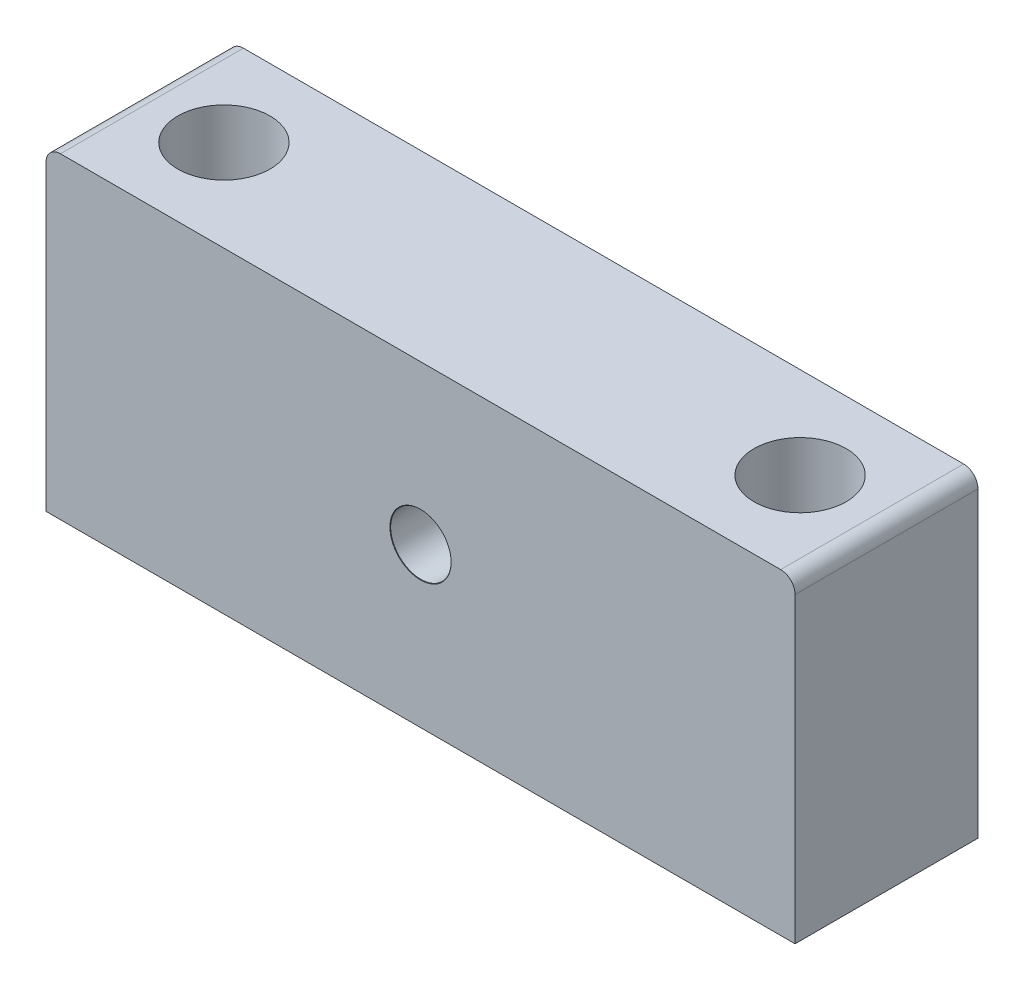
ISO-10303-21;
HEADER;
FILE_DESCRIPTION(('STEP AP214'),'2;1');
FILE_NAME('part.step','',(''),(''),'','','');
FILE_SCHEMA(('AUTOMOTIVE_DESIGN { 1 0 10303 214 1 1 1 1 }'));
ENDSEC;
DATA;
#1=APPLICATION_CONTEXT('core data for automotive mechanical design processes');
#2=APPLICATION_PROTOCOL_DEFINITION('international standard','automotive_design',2000,#1);
#3=PRODUCT_CONTEXT('',#1,'mechanical');
#4=PRODUCT('Part','Part','',(#3));
#5=PRODUCT_RELATED_PRODUCT_CATEGORY('part','',(#4));
#6=PRODUCT_DEFINITION_FORMATION('','',#4);
#7=PRODUCT_DEFINITION_CONTEXT('part definition',#1,'design');
#8=PRODUCT_DEFINITION('design','',#6,#7);
#9=PRODUCT_DEFINITION_SHAPE('','',#8);
#10=(LENGTH_UNIT() NAMED_UNIT(*) SI_UNIT(.MILLI.,.METRE.));
#11=(NAMED_UNIT(*) PLANE_ANGLE_UNIT() SI_UNIT($,.RADIAN.));
#12=(NAMED_UNIT(*) SI_UNIT($,.STERADIAN.) SOLID_ANGLE_UNIT());
#13=UNCERTAINTY_MEASURE_WITH_UNIT(LENGTH_MEASURE(1.E-05),#10,'distance_accuracy_value','');
#14=(GEOMETRIC_REPRESENTATION_CONTEXT(3) GLOBAL_UNCERTAINTY_ASSIGNED_CONTEXT((#13)) GLOBAL_UNIT_ASSIGNED_CONTEXT((#10,
#11,#12)) REPRESENTATION_CONTEXT('',''));
#15=CARTESIAN_POINT('',(0.,0.,0.));
#16=DIRECTION('',(0.,0.,1.));
#17=DIRECTION('',(1.,0.,0.));
#18=AXIS2_PLACEMENT_3D('',#15,#16,#17);
#19=CARTESIAN_POINT('',(26.,0.,-12.7));
#20=DIRECTION('',(1.,0.,0.));
#21=DIRECTION('',(0.,0.,-1.));
#22=AXIS2_PLACEMENT_3D('',#19,#20,#21);
#23=PLANE('',#22);
#24=DIRECTION('',(0.,-1.,0.));
#25=VECTOR('',#24,1.);
#26=CARTESIAN_POINT('',(26.,22.,-12.7));
#27=LINE('',#26,#25);
#28=CARTESIAN_POINT('',(26.,21.,-12.7));
#29=VERTEX_POINT('',#28);
#30=CARTESIAN_POINT('',(26.,0.,-12.7));
#31=VERTEX_POINT('',#30);
#32=EDGE_CURVE('E88',#29,#31,#27,.T.);
#33=ORIENTED_EDGE('',*,*,#32,.F.);
#34=DIRECTION('',(0.,0.,1.));
#35=VECTOR('',#34,1.);
#36=CARTESIAN_POINT('',(26.,21.,-12.7));
#37=LINE('',#36,#35);
#38=CARTESIAN_POINT('',(26.,21.,0.));
#39=VERTEX_POINT('',#38);
#40=EDGE_CURVE('E106',#29,#39,#37,.T.);
#41=ORIENTED_EDGE('',*,*,#40,.T.);
#42=DIRECTION('',(0.,1.,0.));
#43=VECTOR('',#42,1.);
#44=CARTESIAN_POINT('',(26.,0.,0.));
#45=LINE('',#44,#43);
#46=CARTESIAN_POINT('',(26.,0.,0.));
#47=VERTEX_POINT('',#46);
#48=EDGE_CURVE('E102',#47,#39,#45,.T.);
#49=ORIENTED_EDGE('',*,*,#48,.F.);
#50=DIRECTION('',(0.,0.,1.));
#51=VECTOR('',#50,1.);
#52=CARTESIAN_POINT('',(26.,0.,-12.7));
#53=LINE('',#52,#51);
#54=EDGE_CURVE('E100',#31,#47,#53,.T.);
#55=ORIENTED_EDGE('',*,*,#54,.F.);
#56=EDGE_LOOP('',(#33,#41,#49,#55));
#57=FACE_BOUND('',#56,.T.);
#58=ADVANCED_FACE('F33',(#57),#23,.T.);
#59=CARTESIAN_POINT('',(-26.,0.,-12.7));
#60=DIRECTION('',(0.,-1.,0.));
#61=DIRECTION('',(1.,0.,0.));
#62=AXIS2_PLACEMENT_3D('',#59,#60,#61);
#63=PLANE('',#62);
#64=CARTESIAN_POINT('',(-20.,0.,-6.35));
#65=DIRECTION('',(0.,-1.,0.));
#66=DIRECTION('',(0.,0.,-1.));
#67=AXIS2_PLACEMENT_3D('',#64,#65,#66);
#68=CIRCLE('',#67,3.325);
#69=CARTESIAN_POINT('',(-20.,0.,-9.675));
#70=VERTEX_POINT('',#69);
#71=EDGE_CURVE('E200',#70,#70,#68,.T.);
#72=ORIENTED_EDGE('',*,*,#71,.F.);
#73=EDGE_LOOP('',(#72));
#74=FACE_BOUND('',#73,.T.);
#75=CARTESIAN_POINT('',(20.,0.,-6.34999999999999));
#76=DIRECTION('',(0.,-1.,0.));
#77=DIRECTION('',(0.,0.,-1.));
#78=AXIS2_PLACEMENT_3D('',#75,#76,#77);
#79=CIRCLE('',#78,3.325);
#80=CARTESIAN_POINT('',(20.,0.,-9.675));
#81=VERTEX_POINT('',#80);
#82=EDGE_CURVE('E202',#81,#81,#79,.T.);
#83=ORIENTED_EDGE('',*,*,#82,.F.);
#84=EDGE_LOOP('',(#83));
#85=FACE_BOUND('',#84,.T.);
#86=DIRECTION('',(1.,0.,0.));
#87=VECTOR('',#86,1.);
#88=CARTESIAN_POINT('',(-26.,0.,0.));
#89=LINE('',#88,#87);
#90=CARTESIAN_POINT('',(-26.,0.,0.));
#91=VERTEX_POINT('',#90);
#92=EDGE_CURVE('E117',#91,#47,#89,.T.);
#93=ORIENTED_EDGE('',*,*,#92,.F.);
#94=DIRECTION('',(0.,0.,1.));
#95=VECTOR('',#94,1.);
#96=CARTESIAN_POINT('',(-26.,0.,-12.7));
#97=LINE('',#96,#95);
#98=CARTESIAN_POINT('',(-26.,0.,-12.7));
#99=VERTEX_POINT('',#98);
#100=EDGE_CURVE('E107',#99,#91,#97,.T.);
#101=ORIENTED_EDGE('',*,*,#100,.F.);
#102=DIRECTION('',(1.,0.,0.));
#103=VECTOR('',#102,1.);
#104=CARTESIAN_POINT('',(-26.,0.,-12.7));
#105=LINE('',#104,#103);
#106=EDGE_CURVE('E92',#99,#31,#105,.T.);
#107=ORIENTED_EDGE('',*,*,#106,.T.);
#108=ORIENTED_EDGE('',*,*,#54,.T.);
#109=EDGE_LOOP('',(#93,#101,#107,#108));
#110=FACE_BOUND('',#109,.T.);
#111=ADVANCED_FACE('F109',(#74,#85,#110),#63,.T.);
#112=CARTESIAN_POINT('',(-26.,6.,-12.7));
#113=DIRECTION('',(1.,0.,0.));
#114=DIRECTION('',(0.,0.,-1.));
#115=AXIS2_PLACEMENT_3D('',#112,#113,#114);
#116=PLANE('',#115);
#117=DIRECTION('',(0.,1.,0.));
#118=VECTOR('',#117,1.);
#119=CARTESIAN_POINT('',(-26.,6.,0.));
#120=LINE('',#119,#118);
#121=CARTESIAN_POINT('',(-26.,21.,0.));
#122=VERTEX_POINT('',#121);
#123=EDGE_CURVE('E120',#91,#122,#120,.T.);
#124=ORIENTED_EDGE('',*,*,#123,.T.);
#125=DIRECTION('',(0.,0.,1.));
#126=VECTOR('',#125,1.);
#127=CARTESIAN_POINT('',(-26.,21.,-12.7));
#128=LINE('',#127,#126);
#129=CARTESIAN_POINT('',(-26.,21.,-12.7));
#130=VERTEX_POINT('',#129);
#131=EDGE_CURVE('E11',#122,#130,#128,.F.);
#132=ORIENTED_EDGE('',*,*,#131,.T.);
#133=DIRECTION('',(0.,1.,0.));
#134=VECTOR('',#133,1.);
#135=CARTESIAN_POINT('',(-26.,0.,-12.7));
#136=LINE('',#135,#134);
#137=EDGE_CURVE('E111',#99,#130,#136,.T.);
#138=ORIENTED_EDGE('',*,*,#137,.F.);
#139=ORIENTED_EDGE('',*,*,#100,.T.);
#140=EDGE_LOOP('',(#124,#132,#138,#139));
#141=FACE_BOUND('',#140,.T.);
#142=ADVANCED_FACE('F142',(#141),#116,.F.);
#143=CARTESIAN_POINT('',(7.5,22.,-12.7));
#144=DIRECTION('',(0.,1.,0.));
#145=DIRECTION('',(0.,0.,1.));
#146=AXIS2_PLACEMENT_3D('',#143,#144,#145);
#147=PLANE('',#146);
#148=CARTESIAN_POINT('',(-20.,22.,-6.35));
#149=DIRECTION('',(0.,-1.,0.));
#150=DIRECTION('',(0.,0.,-1.));
#151=AXIS2_PLACEMENT_3D('',#148,#149,#150);
#152=CIRCLE('',#151,3.19999999999999);
#153=CARTESIAN_POINT('',(-20.,22.,-9.54999999999999));
#154=VERTEX_POINT('',#153);
#155=EDGE_CURVE('E196',#154,#154,#152,.T.);
#156=ORIENTED_EDGE('',*,*,#155,.T.);
#157=EDGE_LOOP('',(#156));
#158=FACE_BOUND('',#157,.T.);
#159=CARTESIAN_POINT('',(20.,22.,-6.34999999999999));
#160=DIRECTION('',(0.,-1.,0.));
#161=DIRECTION('',(0.,0.,-1.));
#162=AXIS2_PLACEMENT_3D('',#159,#160,#161);
#163=CIRCLE('',#162,3.19999999999999);
#164=CARTESIAN_POINT('',(20.,22.,-9.54999999999999));
#165=VERTEX_POINT('',#164);
#166=EDGE_CURVE('E212',#165,#165,#163,.T.);
#167=ORIENTED_EDGE('',*,*,#166,.T.);
#168=EDGE_LOOP('',(#167));
#169=FACE_BOUND('',#168,.T.);
#170=DIRECTION('',(-1.,0.,0.));
#171=VECTOR('',#170,1.);
#172=CARTESIAN_POINT('',(7.5,22.,0.));
#173=LINE('',#172,#171);
#174=CARTESIAN_POINT('',(25.,22.,0.));
#175=VERTEX_POINT('',#174);
#176=CARTESIAN_POINT('',(-25.,22.,0.));
#177=VERTEX_POINT('',#176);
#178=EDGE_CURVE('E122',#175,#177,#173,.T.);
#179=ORIENTED_EDGE('',*,*,#178,.F.);
#180=DIRECTION('',(0.,0.,1.));
#181=VECTOR('',#180,1.);
#182=CARTESIAN_POINT('',(25.,22.,-12.7));
#183=LINE('',#182,#181);
#184=CARTESIAN_POINT('',(25.,22.,-12.7));
#185=VERTEX_POINT('',#184);
#186=EDGE_CURVE('E54',#175,#185,#183,.F.);
#187=ORIENTED_EDGE('',*,*,#186,.T.);
#188=DIRECTION('',(1.,0.,0.));
#189=VECTOR('',#188,1.);
#190=CARTESIAN_POINT('',(7.5,22.,-12.7));
#191=LINE('',#190,#189);
#192=CARTESIAN_POINT('',(-25.,22.,-12.7));
#193=VERTEX_POINT('',#192);
#194=EDGE_CURVE('E97',#193,#185,#191,.T.);
#195=ORIENTED_EDGE('',*,*,#194,.F.);
#196=DIRECTION('',(0.,0.,1.));
#197=VECTOR('',#196,1.);
#198=CARTESIAN_POINT('',(-25.,22.,0.));
#199=LINE('',#198,#197);
#200=EDGE_CURVE('E131',#193,#177,#199,.T.);
#201=ORIENTED_EDGE('',*,*,#200,.T.);
#202=EDGE_LOOP('',(#179,#187,#195,#201));
#203=FACE_BOUND('',#202,.T.);
#204=ADVANCED_FACE('F139',(#158,#169,#203),#147,.T.);
#205=CARTESIAN_POINT('',(0.,0.,-12.7));
#206=DIRECTION('',(0.,0.,-1.));
#207=DIRECTION('',(-1.,0.,0.));
#208=AXIS2_PLACEMENT_3D('',#205,#206,#207);
#209=PLANE('',#208);
#210=CARTESIAN_POINT('',(0.,11.,-12.7));
#211=DIRECTION('',(0.,0.,1.));
#212=DIRECTION('',(1.,0.,0.));
#213=AXIS2_PLACEMENT_3D('',#210,#211,#212);
#214=CIRCLE('',#213,2.1);
#215=CARTESIAN_POINT('',(2.1,11.,-12.7));
#216=VERTEX_POINT('',#215);
#217=EDGE_CURVE('E118',#216,#216,#214,.T.);
#218=ORIENTED_EDGE('',*,*,#217,.T.);
#219=EDGE_LOOP('',(#218));
#220=FACE_BOUND('',#219,.T.);
#221=ORIENTED_EDGE('',*,*,#194,.T.);
#222=CARTESIAN_POINT('',(25.,21.,-12.7));
#223=DIRECTION('',(0.,0.,-1.));
#224=DIRECTION('',(-1.,0.,0.));
#225=AXIS2_PLACEMENT_3D('',#222,#223,#224);
#226=CIRCLE('',#225,1.);
#227=EDGE_CURVE('E41',#185,#29,#226,.T.);
#228=ORIENTED_EDGE('',*,*,#227,.T.);
#229=ORIENTED_EDGE('',*,*,#32,.T.);
#230=ORIENTED_EDGE('',*,*,#106,.F.);
#231=ORIENTED_EDGE('',*,*,#137,.T.);
#232=CARTESIAN_POINT('',(-25.,21.,-12.7));
#233=DIRECTION('',(0.,0.,-1.));
#234=DIRECTION('',(-1.,0.,0.));
#235=AXIS2_PLACEMENT_3D('',#232,#233,#234);
#236=CIRCLE('',#235,1.);
#237=EDGE_CURVE('E135',#130,#193,#236,.T.);
#238=ORIENTED_EDGE('',*,*,#237,.T.);
#239=EDGE_LOOP('',(#221,#228,#229,#230,#231,#238));
#240=FACE_BOUND('',#239,.T.);
#241=ADVANCED_FACE('F90',(#220,#240),#209,.T.);
#242=CARTESIAN_POINT('',(0.,0.,0.));
#243=DIRECTION('',(0.,0.,-1.));
#244=DIRECTION('',(-1.,0.,0.));
#245=AXIS2_PLACEMENT_3D('',#242,#243,#244);
#246=PLANE('',#245);
#247=CARTESIAN_POINT('',(0.,11.,0.));
#248=DIRECTION('',(0.,0.,1.));
#249=DIRECTION('',(1.,0.,0.));
#250=AXIS2_PLACEMENT_3D('',#247,#248,#249);
#251=CIRCLE('',#250,2.125);
#252=CARTESIAN_POINT('',(2.125,11.,0.));
#253=VERTEX_POINT('',#252);
#254=EDGE_CURVE('E215',#253,#253,#251,.T.);
#255=ORIENTED_EDGE('',*,*,#254,.F.);
#256=EDGE_LOOP('',(#255));
#257=FACE_BOUND('',#256,.T.);
#258=ORIENTED_EDGE('',*,*,#48,.T.);
#259=CARTESIAN_POINT('',(25.,21.,0.));
#260=DIRECTION('',(0.,0.,-1.));
#261=DIRECTION('',(-1.,0.,0.));
#262=AXIS2_PLACEMENT_3D('',#259,#260,#261);
#263=CIRCLE('',#262,1.);
#264=EDGE_CURVE('E129',#39,#175,#263,.F.);
#265=ORIENTED_EDGE('',*,*,#264,.T.);
#266=ORIENTED_EDGE('',*,*,#178,.T.);
#267=CARTESIAN_POINT('',(-25.,21.,0.));
#268=DIRECTION('',(0.,0.,-1.));
#269=DIRECTION('',(-1.,0.,0.));
#270=AXIS2_PLACEMENT_3D('',#267,#268,#269);
#271=CIRCLE('',#270,1.);
#272=EDGE_CURVE('E127',#177,#122,#271,.F.);
#273=ORIENTED_EDGE('',*,*,#272,.T.);
#274=ORIENTED_EDGE('',*,*,#123,.F.);
#275=ORIENTED_EDGE('',*,*,#92,.T.);
#276=EDGE_LOOP('',(#258,#265,#266,#273,#274,#275));
#277=FACE_BOUND('',#276,.T.);
#278=ADVANCED_FACE('F141',(#257,#277),#246,.F.);
#279=CARTESIAN_POINT('',(0.,11.,0.));
#280=DIRECTION('',(0.,0.,1.));
#281=DIRECTION('',(1.,0.,0.));
#282=AXIS2_PLACEMENT_3D('',#279,#280,#281);
#283=CYLINDRICAL_SURFACE('',#282,2.1);
#284=ORIENTED_EDGE('',*,*,#217,.F.);
#285=EDGE_LOOP('',(#284));
#286=FACE_BOUND('',#285,.T.);
#287=CARTESIAN_POINT('',(0.,11.,-0.0250000000000007));
#288=DIRECTION('',(0.,0.,1.));
#289=DIRECTION('',(1.,0.,0.));
#290=AXIS2_PLACEMENT_3D('',#287,#288,#289);
#291=CIRCLE('',#290,2.1);
#292=CARTESIAN_POINT('',(2.1,11.,-0.0250000000000007));
#293=VERTEX_POINT('',#292);
#294=EDGE_CURVE('E218',#293,#293,#291,.T.);
#295=ORIENTED_EDGE('',*,*,#294,.T.);
#296=EDGE_LOOP('',(#295));
#297=FACE_BOUND('',#296,.T.);
#298=ADVANCED_FACE('F169',(#286,#297),#283,.F.);
#299=CARTESIAN_POINT('',(0.,11.,0.));
#300=DIRECTION('',(0.,0.,1.));
#301=DIRECTION('',(1.,0.,0.));
#302=AXIS2_PLACEMENT_3D('',#299,#300,#301);
#303=CONICAL_SURFACE('',#302,2.125,0.785398163397457);
#304=ORIENTED_EDGE('',*,*,#294,.F.);
#305=EDGE_LOOP('',(#304));
#306=FACE_BOUND('',#305,.T.);
#307=ORIENTED_EDGE('',*,*,#254,.T.);
#308=EDGE_LOOP('',(#307));
#309=FACE_BOUND('',#308,.T.);
#310=ADVANCED_FACE('F176',(#306,#309),#303,.F.);
#311=CARTESIAN_POINT('',(20.,0.,-6.34999999999999));
#312=DIRECTION('',(0.,-1.,0.));
#313=DIRECTION('',(0.,0.,-1.));
#314=AXIS2_PLACEMENT_3D('',#311,#312,#313);
#315=CYLINDRICAL_SURFACE('',#314,3.2);
#316=ORIENTED_EDGE('',*,*,#166,.F.);
#317=EDGE_LOOP('',(#316));
#318=FACE_BOUND('',#317,.T.);
#319=CARTESIAN_POINT('',(20.,0.125000000000004,-6.34999999999999));
#320=DIRECTION('',(0.,-1.,0.));
#321=DIRECTION('',(0.,0.,-1.));
#322=AXIS2_PLACEMENT_3D('',#319,#320,#321);
#323=CIRCLE('',#322,3.2);
#324=CARTESIAN_POINT('',(20.,0.125000000000004,-9.54999999999999));
#325=VERTEX_POINT('',#324);
#326=EDGE_CURVE('E209',#325,#325,#323,.T.);
#327=ORIENTED_EDGE('',*,*,#326,.T.);
#328=EDGE_LOOP('',(#327));
#329=FACE_BOUND('',#328,.T.);
#330=ADVANCED_FACE('F180',(#318,#329),#315,.F.);
#331=CARTESIAN_POINT('',(20.,0.,-6.34999999999999));
#332=DIRECTION('',(0.,-1.,0.));
#333=DIRECTION('',(0.,0.,-1.));
#334=AXIS2_PLACEMENT_3D('',#331,#332,#333);
#335=CONICAL_SURFACE('',#334,3.325,0.785398163397462);
#336=ORIENTED_EDGE('',*,*,#326,.F.);
#337=EDGE_LOOP('',(#336));
#338=FACE_BOUND('',#337,.T.);
#339=ORIENTED_EDGE('',*,*,#82,.T.);
#340=EDGE_LOOP('',(#339));
#341=FACE_BOUND('',#340,.T.);
#342=ADVANCED_FACE('F184',(#338,#341),#335,.F.);
#343=CARTESIAN_POINT('',(-20.,0.,-6.35));
#344=DIRECTION('',(0.,-1.,0.));
#345=DIRECTION('',(0.,0.,-1.));
#346=AXIS2_PLACEMENT_3D('',#343,#344,#345);
#347=CYLINDRICAL_SURFACE('',#346,3.2);
#348=ORIENTED_EDGE('',*,*,#155,.F.);
#349=EDGE_LOOP('',(#348));
#350=FACE_BOUND('',#349,.T.);
#351=CARTESIAN_POINT('',(-20.,0.124999999999996,-6.35));
#352=DIRECTION('',(0.,-1.,0.));
#353=DIRECTION('',(0.,0.,-1.));
#354=AXIS2_PLACEMENT_3D('',#351,#352,#353);
#355=CIRCLE('',#354,3.2);
#356=CARTESIAN_POINT('',(-20.,0.124999999999996,-9.55));
#357=VERTEX_POINT('',#356);
#358=EDGE_CURVE('E199',#357,#357,#355,.T.);
#359=ORIENTED_EDGE('',*,*,#358,.T.);
#360=EDGE_LOOP('',(#359));
#361=FACE_BOUND('',#360,.T.);
#362=ADVANCED_FACE('F151',(#350,#361),#347,.F.);
#363=CARTESIAN_POINT('',(-20.,0.,-6.35));
#364=DIRECTION('',(0.,-1.,0.));
#365=DIRECTION('',(0.,0.,-1.));
#366=AXIS2_PLACEMENT_3D('',#363,#364,#365);
#367=CONICAL_SURFACE('',#366,3.325,0.785398163397462);
#368=ORIENTED_EDGE('',*,*,#358,.F.);
#369=EDGE_LOOP('',(#368));
#370=FACE_BOUND('',#369,.T.);
#371=ORIENTED_EDGE('',*,*,#71,.T.);
#372=EDGE_LOOP('',(#371));
#373=FACE_BOUND('',#372,.T.);
#374=ADVANCED_FACE('F146',(#370,#373),#367,.F.);
#375=CARTESIAN_POINT('',(25.,21.,-12.7));
#376=DIRECTION('',(0.,0.,1.));
#377=DIRECTION('',(1.,0.,0.));
#378=AXIS2_PLACEMENT_3D('',#375,#376,#377);
#379=CYLINDRICAL_SURFACE('',#378,1.);
#380=ORIENTED_EDGE('',*,*,#227,.F.);
#381=ORIENTED_EDGE('',*,*,#186,.F.);
#382=ORIENTED_EDGE('',*,*,#264,.F.);
#383=ORIENTED_EDGE('',*,*,#40,.F.);
#384=EDGE_LOOP('',(#380,#381,#382,#383));
#385=FACE_BOUND('',#384,.T.);
#386=ADVANCED_FACE('F144',(#385),#379,.T.);
#387=CARTESIAN_POINT('',(-25.,21.,-12.7));
#388=DIRECTION('',(0.,0.,-1.));
#389=DIRECTION('',(-1.,0.,0.));
#390=AXIS2_PLACEMENT_3D('',#387,#388,#389);
#391=CYLINDRICAL_SURFACE('',#390,1.);
#392=ORIENTED_EDGE('',*,*,#237,.F.);
#393=ORIENTED_EDGE('',*,*,#131,.F.);
#394=ORIENTED_EDGE('',*,*,#272,.F.);
#395=ORIENTED_EDGE('',*,*,#200,.F.);
#396=EDGE_LOOP('',(#392,#393,#394,#395));
#397=FACE_BOUND('',#396,.T.);
#398=ADVANCED_FACE('F35',(#397),#391,.T.);
#399=CLOSED_SHELL('',(#58,#111,#142,#204,#241,#278,#298,#310,#330,#342,#362,#374,#386,#398));
#400=MANIFOLD_SOLID_BREP('B2',#399);
#401=ADVANCED_BREP_SHAPE_REPRESENTATION('',(#18,#400),#14);
#402=SHAPE_DEFINITION_REPRESENTATION(#9,#401);
ENDSEC;
END-ISO-10303-21;
